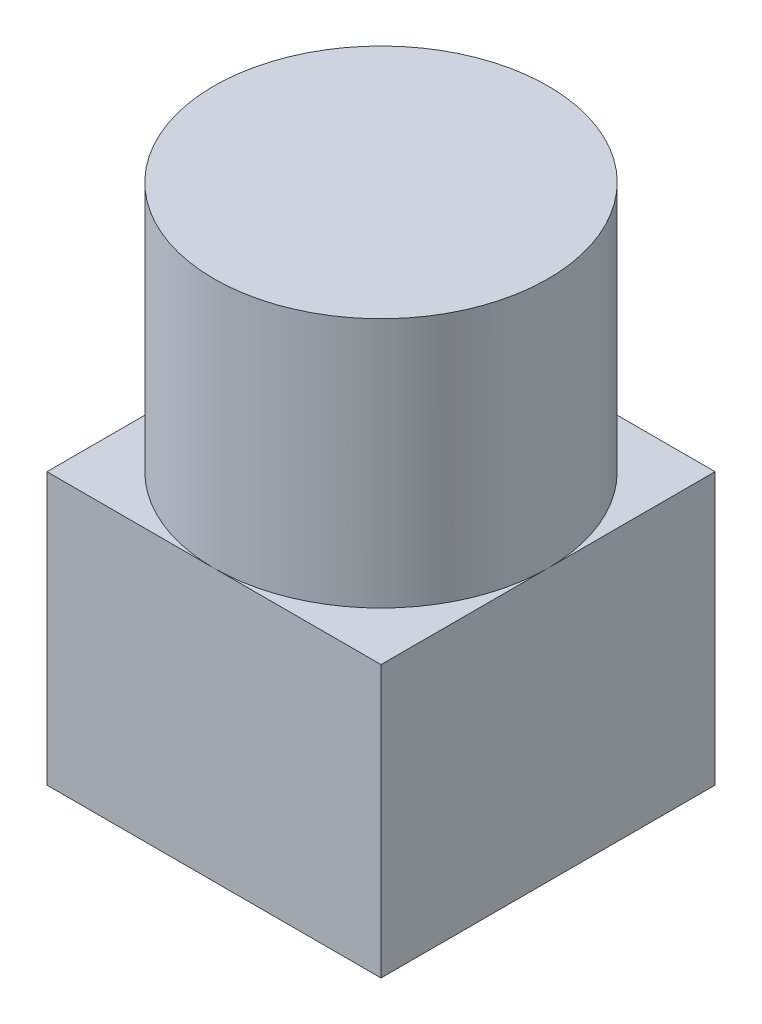
ISO-10303-21;
HEADER;
FILE_DESCRIPTION(('STEP AP214'),'2;1');
FILE_NAME('part.step','',(''),(''),'','','');
FILE_SCHEMA(('AUTOMOTIVE_DESIGN { 1 0 10303 214 1 1 1 1 }'));
ENDSEC;
DATA;
#1=APPLICATION_CONTEXT('core data for automotive mechanical design processes');
#2=APPLICATION_PROTOCOL_DEFINITION('international standard','automotive_design',2000,#1);
#3=PRODUCT_CONTEXT('',#1,'mechanical');
#4=PRODUCT('Part','Part','',(#3));
#5=PRODUCT_RELATED_PRODUCT_CATEGORY('part','',(#4));
#6=PRODUCT_DEFINITION_FORMATION('','',#4);
#7=PRODUCT_DEFINITION_CONTEXT('part definition',#1,'design');
#8=PRODUCT_DEFINITION('design','',#6,#7);
#9=PRODUCT_DEFINITION_SHAPE('','',#8);
#10=(LENGTH_UNIT() NAMED_UNIT(*) SI_UNIT(.MILLI.,.METRE.));
#11=(NAMED_UNIT(*) PLANE_ANGLE_UNIT() SI_UNIT($,.RADIAN.));
#12=(NAMED_UNIT(*) SI_UNIT($,.STERADIAN.) SOLID_ANGLE_UNIT());
#13=UNCERTAINTY_MEASURE_WITH_UNIT(LENGTH_MEASURE(1.E-05),#10,'distance_accuracy_value','');
#14=(GEOMETRIC_REPRESENTATION_CONTEXT(3) GLOBAL_UNCERTAINTY_ASSIGNED_CONTEXT((#13)) GLOBAL_UNIT_ASSIGNED_CONTEXT((#10,
#11,#12)) REPRESENTATION_CONTEXT('',''));
#15=CARTESIAN_POINT('',(0.,0.,0.));
#16=DIRECTION('',(0.,0.,1.));
#17=DIRECTION('',(1.,0.,0.));
#18=AXIS2_PLACEMENT_3D('',#15,#16,#17);
#19=CARTESIAN_POINT('',(0.,6.5,0.));
#20=DIRECTION('',(0.,-1.,0.));
#21=DIRECTION('',(0.,0.,-1.));
#22=AXIS2_PLACEMENT_3D('',#19,#20,#21);
#23=PLANE('',#22);
#24=CARTESIAN_POINT('',(0.,6.5,0.));
#25=DIRECTION('',(0.,1.,0.));
#26=DIRECTION('',(0.,0.,1.));
#27=AXIS2_PLACEMENT_3D('',#24,#25,#26);
#28=CIRCLE('',#27,4.);
#29=CARTESIAN_POINT('',(0.,6.5,4.));
#30=VERTEX_POINT('',#29);
#31=CARTESIAN_POINT('',(4.,6.5,0.));
#32=VERTEX_POINT('',#31);
#33=EDGE_CURVE('E57',#30,#32,#28,.T.);
#34=ORIENTED_EDGE('',*,*,#33,.F.);
#35=DIRECTION('',(1.,0.,0.));
#36=VECTOR('',#35,1.);
#37=CARTESIAN_POINT('',(-4.,6.5,4.));
#38=LINE('',#37,#36);
#39=CARTESIAN_POINT('',(4.,6.5,4.));
#40=VERTEX_POINT('',#39);
#41=EDGE_CURVE('E109',#30,#40,#38,.T.);
#42=ORIENTED_EDGE('',*,*,#41,.T.);
#43=DIRECTION('',(0.,0.,-1.));
#44=VECTOR('',#43,1.);
#45=CARTESIAN_POINT('',(4.,6.5,4.));
#46=LINE('',#45,#44);
#47=EDGE_CURVE('E121',#40,#32,#46,.T.);
#48=ORIENTED_EDGE('',*,*,#47,.T.);
#49=EDGE_LOOP('',(#34,#42,#48));
#50=FACE_BOUND('',#49,.T.);
#51=ADVANCED_FACE('F45',(#50),#23,.F.);
#52=CARTESIAN_POINT('',(0.,6.5,-4.));
#53=VERTEX_POINT('',#52);
#54=EDGE_CURVE('E11',#32,#53,#28,.T.);
#55=ORIENTED_EDGE('',*,*,#54,.F.);
#56=CARTESIAN_POINT('',(4.,6.5,-4.));
#57=VERTEX_POINT('',#56);
#58=EDGE_CURVE('E136',#32,#57,#46,.T.);
#59=ORIENTED_EDGE('',*,*,#58,.T.);
#60=DIRECTION('',(-1.,0.,0.));
#61=VECTOR('',#60,1.);
#62=CARTESIAN_POINT('',(-4.,6.5,-4.));
#63=LINE('',#62,#61);
#64=EDGE_CURVE('E137',#57,#53,#63,.T.);
#65=ORIENTED_EDGE('',*,*,#64,.T.);
#66=EDGE_LOOP('',(#55,#59,#65));
#67=FACE_BOUND('',#66,.T.);
#68=ADVANCED_FACE('F196',(#67),#23,.F.);
#69=CARTESIAN_POINT('',(-4.,6.5,0.));
#70=VERTEX_POINT('',#69);
#71=EDGE_CURVE('E55',#53,#70,#28,.T.);
#72=ORIENTED_EDGE('',*,*,#71,.F.);
#73=CARTESIAN_POINT('',(-4.,6.5,-4.));
#74=VERTEX_POINT('',#73);
#75=EDGE_CURVE('E135',#53,#74,#63,.T.);
#76=ORIENTED_EDGE('',*,*,#75,.T.);
#77=DIRECTION('',(0.,0.,1.));
#78=VECTOR('',#77,1.);
#79=CARTESIAN_POINT('',(-4.,6.5,4.));
#80=LINE('',#79,#78);
#81=EDGE_CURVE('E119',#74,#70,#80,.T.);
#82=ORIENTED_EDGE('',*,*,#81,.T.);
#83=EDGE_LOOP('',(#72,#76,#82));
#84=FACE_BOUND('',#83,.T.);
#85=ADVANCED_FACE('F200',(#84),#23,.F.);
#86=CARTESIAN_POINT('',(4.,6.5,4.));
#87=DIRECTION('',(-1.,0.,0.));
#88=DIRECTION('',(0.,0.,1.));
#89=AXIS2_PLACEMENT_3D('',#86,#87,#88);
#90=PLANE('',#89);
#91=DIRECTION('',(0.,0.,-1.));
#92=VECTOR('',#91,1.);
#93=CARTESIAN_POINT('',(4.,0.,4.));
#94=LINE('',#93,#92);
#95=CARTESIAN_POINT('',(4.,0.,4.));
#96=VERTEX_POINT('',#95);
#97=CARTESIAN_POINT('',(4.,0.,-4.));
#98=VERTEX_POINT('',#97);
#99=EDGE_CURVE('E143',#96,#98,#94,.T.);
#100=ORIENTED_EDGE('',*,*,#99,.T.);
#101=DIRECTION('',(0.,-1.,0.));
#102=VECTOR('',#101,1.);
#103=CARTESIAN_POINT('',(4.,6.5,-4.));
#104=LINE('',#103,#102);
#105=EDGE_CURVE('E49',#57,#98,#104,.T.);
#106=ORIENTED_EDGE('',*,*,#105,.F.);
#107=ORIENTED_EDGE('',*,*,#58,.F.);
#108=ORIENTED_EDGE('',*,*,#47,.F.);
#109=DIRECTION('',(0.,-1.,0.));
#110=VECTOR('',#109,1.);
#111=CARTESIAN_POINT('',(4.,6.5,4.));
#112=LINE('',#111,#110);
#113=EDGE_CURVE('E108',#40,#96,#112,.T.);
#114=ORIENTED_EDGE('',*,*,#113,.T.);
#115=EDGE_LOOP('',(#100,#106,#107,#108,#114));
#116=FACE_BOUND('',#115,.T.);
#117=ADVANCED_FACE('F47',(#116),#90,.F.);
#118=CARTESIAN_POINT('',(-4.,6.5,-4.));
#119=DIRECTION('',(0.,0.,1.));
#120=DIRECTION('',(1.,0.,0.));
#121=AXIS2_PLACEMENT_3D('',#118,#119,#120);
#122=PLANE('',#121);
#123=DIRECTION('',(-1.,0.,0.));
#124=VECTOR('',#123,1.);
#125=CARTESIAN_POINT('',(-4.,0.,-4.));
#126=LINE('',#125,#124);
#127=CARTESIAN_POINT('',(-4.,0.,-4.));
#128=VERTEX_POINT('',#127);
#129=EDGE_CURVE('E147',#98,#128,#126,.T.);
#130=ORIENTED_EDGE('',*,*,#129,.T.);
#131=DIRECTION('',(0.,-1.,0.));
#132=VECTOR('',#131,1.);
#133=CARTESIAN_POINT('',(-4.,6.5,-4.));
#134=LINE('',#133,#132);
#135=EDGE_CURVE('E130',#74,#128,#134,.T.);
#136=ORIENTED_EDGE('',*,*,#135,.F.);
#137=ORIENTED_EDGE('',*,*,#75,.F.);
#138=ORIENTED_EDGE('',*,*,#64,.F.);
#139=ORIENTED_EDGE('',*,*,#105,.T.);
#140=EDGE_LOOP('',(#130,#136,#137,#138,#139));
#141=FACE_BOUND('',#140,.T.);
#142=ADVANCED_FACE('F209',(#141),#122,.F.);
#143=CARTESIAN_POINT('',(-4.,6.5,4.));
#144=DIRECTION('',(1.,0.,0.));
#145=DIRECTION('',(0.,0.,-1.));
#146=AXIS2_PLACEMENT_3D('',#143,#144,#145);
#147=PLANE('',#146);
#148=DIRECTION('',(0.,0.,1.));
#149=VECTOR('',#148,1.);
#150=CARTESIAN_POINT('',(-4.,0.,4.));
#151=LINE('',#150,#149);
#152=CARTESIAN_POINT('',(-4.,0.,4.));
#153=VERTEX_POINT('',#152);
#154=EDGE_CURVE('E150',#128,#153,#151,.T.);
#155=ORIENTED_EDGE('',*,*,#154,.T.);
#156=DIRECTION('',(0.,-1.,0.));
#157=VECTOR('',#156,1.);
#158=CARTESIAN_POINT('',(-4.,6.5,4.));
#159=LINE('',#158,#157);
#160=CARTESIAN_POINT('',(-4.,6.5,4.));
#161=VERTEX_POINT('',#160);
#162=EDGE_CURVE('E158',#161,#153,#159,.T.);
#163=ORIENTED_EDGE('',*,*,#162,.F.);
#164=EDGE_CURVE('E103',#70,#161,#80,.T.);
#165=ORIENTED_EDGE('',*,*,#164,.F.);
#166=ORIENTED_EDGE('',*,*,#81,.F.);
#167=ORIENTED_EDGE('',*,*,#135,.T.);
#168=EDGE_LOOP('',(#155,#163,#165,#166,#167));
#169=FACE_BOUND('',#168,.T.);
#170=ADVANCED_FACE('F166',(#169),#147,.F.);
#171=CARTESIAN_POINT('',(-4.,6.5,4.));
#172=DIRECTION('',(0.,0.,-1.));
#173=DIRECTION('',(-1.,0.,0.));
#174=AXIS2_PLACEMENT_3D('',#171,#172,#173);
#175=PLANE('',#174);
#176=DIRECTION('',(1.,0.,0.));
#177=VECTOR('',#176,1.);
#178=CARTESIAN_POINT('',(-4.,0.,4.));
#179=LINE('',#178,#177);
#180=EDGE_CURVE('E153',#153,#96,#179,.T.);
#181=ORIENTED_EDGE('',*,*,#180,.T.);
#182=ORIENTED_EDGE('',*,*,#113,.F.);
#183=ORIENTED_EDGE('',*,*,#41,.F.);
#184=EDGE_CURVE('E100',#161,#30,#38,.T.);
#185=ORIENTED_EDGE('',*,*,#184,.F.);
#186=ORIENTED_EDGE('',*,*,#162,.T.);
#187=EDGE_LOOP('',(#181,#182,#183,#185,#186));
#188=FACE_BOUND('',#187,.T.);
#189=ADVANCED_FACE('F113',(#188),#175,.F.);
#190=EDGE_CURVE('E64',#70,#30,#28,.T.);
#191=ORIENTED_EDGE('',*,*,#190,.F.);
#192=ORIENTED_EDGE('',*,*,#164,.T.);
#193=ORIENTED_EDGE('',*,*,#184,.T.);
#194=EDGE_LOOP('',(#191,#192,#193));
#195=FACE_BOUND('',#194,.T.);
#196=ADVANCED_FACE('F102',(#195),#23,.F.);
#197=CARTESIAN_POINT('',(0.,0.,0.));
#198=DIRECTION('',(0.,-1.,0.));
#199=DIRECTION('',(0.,0.,-1.));
#200=AXIS2_PLACEMENT_3D('',#197,#198,#199);
#201=PLANE('',#200);
#202=ORIENTED_EDGE('',*,*,#99,.F.);
#203=ORIENTED_EDGE('',*,*,#180,.F.);
#204=ORIENTED_EDGE('',*,*,#154,.F.);
#205=ORIENTED_EDGE('',*,*,#129,.F.);
#206=EDGE_LOOP('',(#202,#203,#204,#205));
#207=FACE_BOUND('',#206,.T.);
#208=ADVANCED_FACE('F171',(#207),#201,.T.);
#209=CARTESIAN_POINT('',(0.,12.5,0.));
#210=DIRECTION('',(0.,-1.,0.));
#211=DIRECTION('',(0.,0.,-1.));
#212=AXIS2_PLACEMENT_3D('',#209,#210,#211);
#213=CYLINDRICAL_SURFACE('',#212,4.);
#214=CARTESIAN_POINT('',(0.,12.5,0.));
#215=DIRECTION('',(0.,1.,0.));
#216=DIRECTION('',(0.,0.,1.));
#217=AXIS2_PLACEMENT_3D('',#214,#215,#216);
#218=CIRCLE('',#217,4.);
#219=CARTESIAN_POINT('',(0.,12.5,4.));
#220=VERTEX_POINT('',#219);
#221=EDGE_CURVE('E124',#220,#220,#218,.T.);
#222=ORIENTED_EDGE('',*,*,#221,.F.);
#223=EDGE_LOOP('',(#222));
#224=FACE_BOUND('',#223,.T.);
#225=ORIENTED_EDGE('',*,*,#33,.T.);
#226=ORIENTED_EDGE('',*,*,#54,.T.);
#227=ORIENTED_EDGE('',*,*,#71,.T.);
#228=ORIENTED_EDGE('',*,*,#190,.T.);
#229=EDGE_LOOP('',(#225,#226,#227,#228));
#230=FACE_BOUND('',#229,.T.);
#231=ADVANCED_FACE('F125',(#224,#230),#213,.T.);
#232=CARTESIAN_POINT('',(0.,12.5,0.));
#233=DIRECTION('',(0.,1.,0.));
#234=DIRECTION('',(0.,0.,1.));
#235=AXIS2_PLACEMENT_3D('',#232,#233,#234);
#236=PLANE('',#235);
#237=ORIENTED_EDGE('',*,*,#221,.T.);
#238=EDGE_LOOP('',(#237));
#239=FACE_BOUND('',#238,.T.);
#240=ADVANCED_FACE('F183',(#239),#236,.T.);
#241=CLOSED_SHELL('',(#51,#68,#85,#117,#142,#170,#189,#196,#208,#231,#240));
#242=MANIFOLD_SOLID_BREP('B2',#241);
#243=ADVANCED_BREP_SHAPE_REPRESENTATION('',(#18,#242),#14);
#244=SHAPE_DEFINITION_REPRESENTATION(#9,#243);
ENDSEC;
END-ISO-10303-21;
